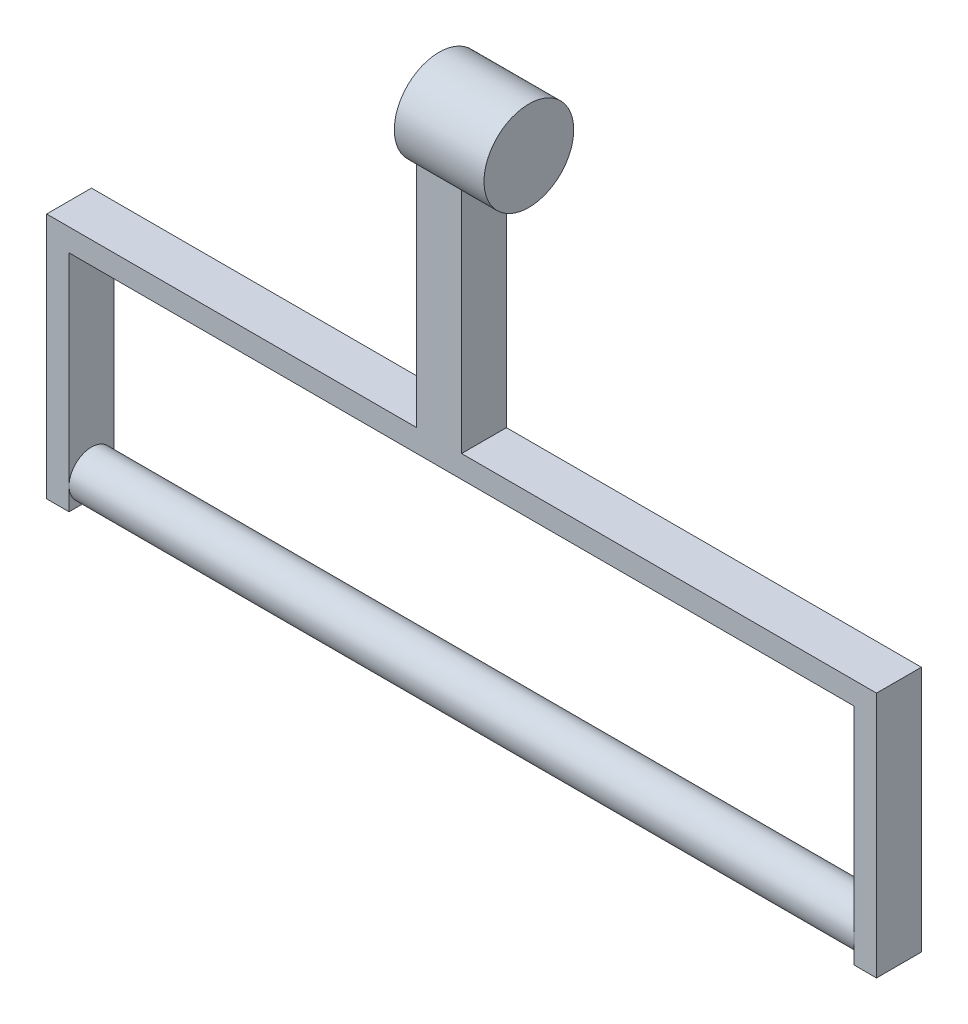
ISO-10303-21;
HEADER;
FILE_DESCRIPTION(('STEP AP214'),'2;1');
FILE_NAME('part.step','',(''),(''),'','','');
FILE_SCHEMA(('AUTOMOTIVE_DESIGN { 1 0 10303 214 1 1 1 1 }'));
ENDSEC;
DATA;
#1=APPLICATION_CONTEXT('core data for automotive mechanical design processes');
#2=APPLICATION_PROTOCOL_DEFINITION('international standard','automotive_design',2000,#1);
#3=PRODUCT_CONTEXT('',#1,'mechanical');
#4=PRODUCT('Part','Part','',(#3));
#5=PRODUCT_RELATED_PRODUCT_CATEGORY('part','',(#4));
#6=PRODUCT_DEFINITION_FORMATION('','',#4);
#7=PRODUCT_DEFINITION_CONTEXT('part definition',#1,'design');
#8=PRODUCT_DEFINITION('design','',#6,#7);
#9=PRODUCT_DEFINITION_SHAPE('','',#8);
#10=(LENGTH_UNIT() NAMED_UNIT(*) SI_UNIT(.MILLI.,.METRE.));
#11=(NAMED_UNIT(*) PLANE_ANGLE_UNIT() SI_UNIT($,.RADIAN.));
#12=(NAMED_UNIT(*) SI_UNIT($,.STERADIAN.) SOLID_ANGLE_UNIT());
#13=UNCERTAINTY_MEASURE_WITH_UNIT(LENGTH_MEASURE(1.E-05),#10,'distance_accuracy_value','');
#14=(GEOMETRIC_REPRESENTATION_CONTEXT(3) GLOBAL_UNCERTAINTY_ASSIGNED_CONTEXT((#13)) GLOBAL_UNIT_ASSIGNED_CONTEXT((#10,
#11,#12)) REPRESENTATION_CONTEXT('',''));
#15=CARTESIAN_POINT('',(0.,0.,0.));
#16=DIRECTION('',(0.,0.,1.));
#17=DIRECTION('',(1.,0.,0.));
#18=AXIS2_PLACEMENT_3D('',#15,#16,#17);
#19=CARTESIAN_POINT('',(0.,-59.9999999999999,0.));
#20=DIRECTION('',(-1.,0.,0.));
#21=DIRECTION('',(0.,0.,1.));
#22=AXIS2_PLACEMENT_3D('',#19,#20,#21);
#23=PLANE('',#22);
#24=CARTESIAN_POINT('',(0.,0.,5.));
#25=DIRECTION('',(1.,0.,0.));
#26=DIRECTION('',(0.,0.,-1.));
#27=AXIS2_PLACEMENT_3D('',#24,#25,#26);
#28=CIRCLE('',#27,10.);
#29=CARTESIAN_POINT('',(0.,-8.66025403784438,10.));
#30=VERTEX_POINT('',#29);
#31=CARTESIAN_POINT('',(0.,-8.66025403784438,0.));
#32=VERTEX_POINT('',#31);
#33=EDGE_CURVE('E182',#30,#32,#28,.T.);
#34=ORIENTED_EDGE('',*,*,#33,.F.);
#35=DIRECTION('',(0.,1.,0.));
#36=VECTOR('',#35,1.);
#37=CARTESIAN_POINT('',(0.,-59.9999999999999,10.));
#38=LINE('',#37,#36);
#39=CARTESIAN_POINT('',(0.,-59.9999999999999,10.));
#40=VERTEX_POINT('',#39);
#41=EDGE_CURVE('E189',#40,#30,#38,.T.);
#42=ORIENTED_EDGE('',*,*,#41,.F.);
#43=DIRECTION('',(0.,0.,1.));
#44=VECTOR('',#43,1.);
#45=CARTESIAN_POINT('',(0.,-59.9999999999999,0.));
#46=LINE('',#45,#44);
#47=CARTESIAN_POINT('',(0.,-59.9999999999999,0.));
#48=VERTEX_POINT('',#47);
#49=EDGE_CURVE('E206',#48,#40,#46,.T.);
#50=ORIENTED_EDGE('',*,*,#49,.F.);
#51=DIRECTION('',(0.,1.,0.));
#52=VECTOR('',#51,1.);
#53=CARTESIAN_POINT('',(0.,-59.9999999999999,0.));
#54=LINE('',#53,#52);
#55=EDGE_CURVE('E196',#48,#32,#54,.T.);
#56=ORIENTED_EDGE('',*,*,#55,.T.);
#57=EDGE_LOOP('',(#34,#42,#50,#56));
#58=FACE_BOUND('',#57,.T.);
#59=ADVANCED_FACE('F65',(#58),#23,.F.);
#60=CARTESIAN_POINT('',(-10.,0.,10.));
#61=DIRECTION('',(1.,0.,0.));
#62=DIRECTION('',(0.,1.,0.));
#63=AXIS2_PLACEMENT_3D('',#60,#61,#62);
#64=PLANE('',#63);
#65=DIRECTION('',(0.,-1.,0.));
#66=VECTOR('',#65,1.);
#67=CARTESIAN_POINT('',(-10.,0.,10.));
#68=LINE('',#67,#66);
#69=CARTESIAN_POINT('',(-10.,-8.66025403784438,10.));
#70=VERTEX_POINT('',#69);
#71=CARTESIAN_POINT('',(-9.99999999999999,-60.,10.));
#72=VERTEX_POINT('',#71);
#73=EDGE_CURVE('E73',#70,#72,#68,.T.);
#74=ORIENTED_EDGE('',*,*,#73,.F.);
#75=CARTESIAN_POINT('',(-10.,0.,5.00000000000001));
#76=DIRECTION('',(1.,0.,0.));
#77=DIRECTION('',(0.,0.,-1.));
#78=AXIS2_PLACEMENT_3D('',#75,#76,#77);
#79=CIRCLE('',#78,10.);
#80=CARTESIAN_POINT('',(-10.,-8.66025403784438,0.));
#81=VERTEX_POINT('',#80);
#82=EDGE_CURVE('E184',#81,#70,#79,.T.);
#83=ORIENTED_EDGE('',*,*,#82,.F.);
#84=DIRECTION('',(0.,-1.,0.));
#85=VECTOR('',#84,1.);
#86=CARTESIAN_POINT('',(-10.,0.,0.));
#87=LINE('',#86,#85);
#88=CARTESIAN_POINT('',(-9.99999999999999,-60.,0.));
#89=VERTEX_POINT('',#88);
#90=EDGE_CURVE('E284',#81,#89,#87,.T.);
#91=ORIENTED_EDGE('',*,*,#90,.T.);
#92=DIRECTION('',(0.,0.,-1.));
#93=VECTOR('',#92,1.);
#94=CARTESIAN_POINT('',(-9.99999999999999,-60.,10.));
#95=LINE('',#94,#93);
#96=EDGE_CURVE('E12',#72,#89,#95,.T.);
#97=ORIENTED_EDGE('',*,*,#96,.F.);
#98=EDGE_LOOP('',(#74,#83,#91,#97));
#99=FACE_BOUND('',#98,.T.);
#100=ADVANCED_FACE('F67',(#99),#64,.F.);
#101=CARTESIAN_POINT('',(0.,0.,10.));
#102=DIRECTION('',(0.,0.,1.));
#103=DIRECTION('',(1.,0.,0.));
#104=AXIS2_PLACEMENT_3D('',#101,#102,#103);
#105=PLANE('',#104);
#106=ORIENTED_EDGE('',*,*,#41,.T.);
#107=DIRECTION('',(1.,0.,0.));
#108=VECTOR('',#107,1.);
#109=CARTESIAN_POINT('',(-10.,-8.66025403784438,10.));
#110=LINE('',#109,#108);
#111=EDGE_CURVE('E176',#70,#30,#110,.T.);
#112=ORIENTED_EDGE('',*,*,#111,.F.);
#113=ORIENTED_EDGE('',*,*,#73,.T.);
#114=DIRECTION('',(-1.,0.,0.));
#115=VECTOR('',#114,1.);
#116=CARTESIAN_POINT('',(0.,-60.,10.));
#117=LINE('',#116,#115);
#118=CARTESIAN_POINT('',(-92.5,-60.,10.));
#119=VERTEX_POINT('',#118);
#120=EDGE_CURVE('E287',#72,#119,#117,.T.);
#121=ORIENTED_EDGE('',*,*,#120,.T.);
#122=DIRECTION('',(0.,1.,0.));
#123=VECTOR('',#122,1.);
#124=CARTESIAN_POINT('',(-92.5,-115.,10.));
#125=LINE('',#124,#123);
#126=CARTESIAN_POINT('',(-92.5,-115.,10.));
#127=VERTEX_POINT('',#126);
#128=EDGE_CURVE('E257',#127,#119,#125,.T.);
#129=ORIENTED_EDGE('',*,*,#128,.F.);
#130=DIRECTION('',(-1.,0.,0.));
#131=VECTOR('',#130,1.);
#132=CARTESIAN_POINT('',(0.,-115.,10.));
#133=LINE('',#132,#131);
#134=CARTESIAN_POINT('',(-87.5,-115.,10.));
#135=VERTEX_POINT('',#134);
#136=EDGE_CURVE('E255',#135,#127,#133,.T.);
#137=ORIENTED_EDGE('',*,*,#136,.F.);
#138=DIRECTION('',(0.,1.,0.));
#139=VECTOR('',#138,1.);
#140=CARTESIAN_POINT('',(-87.5,-115.,10.));
#141=LINE('',#140,#139);
#142=CARTESIAN_POINT('',(-87.5,-110.,10.));
#143=VERTEX_POINT('',#142);
#144=EDGE_CURVE('E263',#135,#143,#141,.T.);
#145=ORIENTED_EDGE('',*,*,#144,.T.);
#146=CARTESIAN_POINT('',(-87.5,-65.,10.));
#147=VERTEX_POINT('',#146);
#148=EDGE_CURVE('E262',#143,#147,#141,.T.);
#149=ORIENTED_EDGE('',*,*,#148,.T.);
#150=DIRECTION('',(-1.,0.,0.));
#151=VECTOR('',#150,1.);
#152=CARTESIAN_POINT('',(0.,-65.,10.));
#153=LINE('',#152,#151);
#154=CARTESIAN_POINT('',(87.5,-65.,10.));
#155=VERTEX_POINT('',#154);
#156=EDGE_CURVE('E281',#155,#147,#153,.T.);
#157=ORIENTED_EDGE('',*,*,#156,.F.);
#158=DIRECTION('',(0.,1.,0.));
#159=VECTOR('',#158,1.);
#160=CARTESIAN_POINT('',(87.5,-115.,10.));
#161=LINE('',#160,#159);
#162=CARTESIAN_POINT('',(87.5,-110.,10.));
#163=VERTEX_POINT('',#162);
#164=EDGE_CURVE('E239',#163,#155,#161,.T.);
#165=ORIENTED_EDGE('',*,*,#164,.F.);
#166=CARTESIAN_POINT('',(87.5,-115.,10.));
#167=VERTEX_POINT('',#166);
#168=EDGE_CURVE('E240',#167,#163,#161,.T.);
#169=ORIENTED_EDGE('',*,*,#168,.F.);
#170=DIRECTION('',(-1.,0.,0.));
#171=VECTOR('',#170,1.);
#172=CARTESIAN_POINT('',(0.,-115.,10.));
#173=LINE('',#172,#171);
#174=CARTESIAN_POINT('',(92.5,-115.,10.));
#175=VERTEX_POINT('',#174);
#176=EDGE_CURVE('E221',#175,#167,#173,.T.);
#177=ORIENTED_EDGE('',*,*,#176,.F.);
#178=DIRECTION('',(0.,1.,0.));
#179=VECTOR('',#178,1.);
#180=CARTESIAN_POINT('',(92.5,-115.,10.));
#181=LINE('',#180,#179);
#182=CARTESIAN_POINT('',(92.5,-60.,10.));
#183=VERTEX_POINT('',#182);
#184=EDGE_CURVE('E243',#175,#183,#181,.T.);
#185=ORIENTED_EDGE('',*,*,#184,.T.);
#186=EDGE_CURVE('E192',#183,#40,#117,.T.);
#187=ORIENTED_EDGE('',*,*,#186,.T.);
#188=EDGE_LOOP('',(#106,#112,#113,#121,#129,#137,#145,#149,#157,#165,#169,#177,#185,#187));
#189=FACE_BOUND('',#188,.T.);
#190=ADVANCED_FACE('F190',(#189),#105,.T.);
#191=CARTESIAN_POINT('',(0.,0.,0.));
#192=DIRECTION('',(0.,0.,1.));
#193=DIRECTION('',(1.,0.,0.));
#194=AXIS2_PLACEMENT_3D('',#191,#192,#193);
#195=PLANE('',#194);
#196=ORIENTED_EDGE('',*,*,#90,.F.);
#197=DIRECTION('',(1.,0.,0.));
#198=VECTOR('',#197,1.);
#199=CARTESIAN_POINT('',(-10.,-8.66025403784438,0.));
#200=LINE('',#199,#198);
#201=EDGE_CURVE('E186',#81,#32,#200,.T.);
#202=ORIENTED_EDGE('',*,*,#201,.T.);
#203=ORIENTED_EDGE('',*,*,#55,.F.);
#204=DIRECTION('',(-1.,0.,0.));
#205=VECTOR('',#204,1.);
#206=CARTESIAN_POINT('',(0.,-60.,0.));
#207=LINE('',#206,#205);
#208=CARTESIAN_POINT('',(92.5,-60.,0.));
#209=VERTEX_POINT('',#208);
#210=EDGE_CURVE('E285',#209,#48,#207,.T.);
#211=ORIENTED_EDGE('',*,*,#210,.F.);
#212=DIRECTION('',(0.,1.,0.));
#213=VECTOR('',#212,1.);
#214=CARTESIAN_POINT('',(92.5,-115.,0.));
#215=LINE('',#214,#213);
#216=CARTESIAN_POINT('',(92.5,-115.,0.));
#217=VERTEX_POINT('',#216);
#218=EDGE_CURVE('E230',#217,#209,#215,.T.);
#219=ORIENTED_EDGE('',*,*,#218,.F.);
#220=DIRECTION('',(1.,0.,0.));
#221=VECTOR('',#220,1.);
#222=CARTESIAN_POINT('',(0.,-115.,0.));
#223=LINE('',#222,#221);
#224=CARTESIAN_POINT('',(87.5,-115.,0.));
#225=VERTEX_POINT('',#224);
#226=EDGE_CURVE('E228',#225,#217,#223,.T.);
#227=ORIENTED_EDGE('',*,*,#226,.F.);
#228=DIRECTION('',(0.,1.,0.));
#229=VECTOR('',#228,1.);
#230=CARTESIAN_POINT('',(87.5,-115.,0.));
#231=LINE('',#230,#229);
#232=CARTESIAN_POINT('',(87.5000000000001,-110.,0.));
#233=VERTEX_POINT('',#232);
#234=EDGE_CURVE('E236',#225,#233,#231,.T.);
#235=ORIENTED_EDGE('',*,*,#234,.T.);
#236=CARTESIAN_POINT('',(87.5,-65.,0.));
#237=VERTEX_POINT('',#236);
#238=EDGE_CURVE('E235',#233,#237,#231,.T.);
#239=ORIENTED_EDGE('',*,*,#238,.T.);
#240=DIRECTION('',(-1.,0.,0.));
#241=VECTOR('',#240,1.);
#242=CARTESIAN_POINT('',(0.,-65.,0.));
#243=LINE('',#242,#241);
#244=CARTESIAN_POINT('',(-87.5,-65.,0.));
#245=VERTEX_POINT('',#244);
#246=EDGE_CURVE('E275',#237,#245,#243,.T.);
#247=ORIENTED_EDGE('',*,*,#246,.T.);
#248=DIRECTION('',(0.,1.,0.));
#249=VECTOR('',#248,1.);
#250=CARTESIAN_POINT('',(-87.5,-115.,0.));
#251=LINE('',#250,#249);
#252=CARTESIAN_POINT('',(-87.5,-110.,0.));
#253=VERTEX_POINT('',#252);
#254=EDGE_CURVE('E265',#253,#245,#251,.T.);
#255=ORIENTED_EDGE('',*,*,#254,.F.);
#256=CARTESIAN_POINT('',(-87.5,-115.,0.));
#257=VERTEX_POINT('',#256);
#258=EDGE_CURVE('E266',#257,#253,#251,.T.);
#259=ORIENTED_EDGE('',*,*,#258,.F.);
#260=DIRECTION('',(1.,0.,0.));
#261=VECTOR('',#260,1.);
#262=CARTESIAN_POINT('',(0.,-115.,-1.98239700611978E-13));
#263=LINE('',#262,#261);
#264=CARTESIAN_POINT('',(-92.5,-115.,0.));
#265=VERTEX_POINT('',#264);
#266=EDGE_CURVE('E249',#265,#257,#263,.T.);
#267=ORIENTED_EDGE('',*,*,#266,.F.);
#268=DIRECTION('',(0.,1.,0.));
#269=VECTOR('',#268,1.);
#270=CARTESIAN_POINT('',(-92.5,-115.,0.));
#271=LINE('',#270,#269);
#272=CARTESIAN_POINT('',(-92.5,-60.,0.));
#273=VERTEX_POINT('',#272);
#274=EDGE_CURVE('E268',#265,#273,#271,.T.);
#275=ORIENTED_EDGE('',*,*,#274,.T.);
#276=EDGE_CURVE('E271',#89,#273,#207,.T.);
#277=ORIENTED_EDGE('',*,*,#276,.F.);
#278=EDGE_LOOP('',(#196,#202,#203,#211,#219,#227,#235,#239,#247,#255,#259,#267,#275,#277));
#279=FACE_BOUND('',#278,.T.);
#280=ADVANCED_FACE('F297',(#279),#195,.F.);
#281=CARTESIAN_POINT('',(-87.5,-115.,0.));
#282=DIRECTION('',(-1.,0.,0.));
#283=DIRECTION('',(0.,0.,1.));
#284=AXIS2_PLACEMENT_3D('',#281,#282,#283);
#285=PLANE('',#284);
#286=CARTESIAN_POINT('',(-87.5,-110.,5.));
#287=DIRECTION('',(1.,0.,0.));
#288=DIRECTION('',(0.,0.,-1.));
#289=AXIS2_PLACEMENT_3D('',#286,#287,#288);
#290=CIRCLE('',#289,5.);
#291=CARTESIAN_POINT('',(-87.5,-115.,5.));
#292=VERTEX_POINT('',#291);
#293=EDGE_CURVE('E217',#143,#292,#290,.T.);
#294=ORIENTED_EDGE('',*,*,#293,.F.);
#295=ORIENTED_EDGE('',*,*,#144,.F.);
#296=DIRECTION('',(0.,0.,1.));
#297=VECTOR('',#296,1.);
#298=CARTESIAN_POINT('',(-87.5,-115.,0.));
#299=LINE('',#298,#297);
#300=EDGE_CURVE('E251',#292,#135,#299,.T.);
#301=ORIENTED_EDGE('',*,*,#300,.F.);
#302=EDGE_LOOP('',(#294,#295,#301));
#303=FACE_BOUND('',#302,.T.);
#304=ADVANCED_FACE('F311',(#303),#285,.F.);
#305=EDGE_CURVE('E88',#292,#253,#290,.T.);
#306=ORIENTED_EDGE('',*,*,#305,.F.);
#307=EDGE_CURVE('E252',#257,#292,#299,.T.);
#308=ORIENTED_EDGE('',*,*,#307,.F.);
#309=ORIENTED_EDGE('',*,*,#258,.T.);
#310=EDGE_LOOP('',(#306,#308,#309));
#311=FACE_BOUND('',#310,.T.);
#312=ADVANCED_FACE('F404',(#311),#285,.F.);
#313=CARTESIAN_POINT('',(87.5,-115.,0.));
#314=DIRECTION('',(-1.,0.,0.));
#315=DIRECTION('',(0.,0.,1.));
#316=AXIS2_PLACEMENT_3D('',#313,#314,#315);
#317=PLANE('',#316);
#318=ORIENTED_EDGE('',*,*,#168,.T.);
#319=CARTESIAN_POINT('',(87.5000000000001,-110.,5.));
#320=DIRECTION('',(1.,0.,0.));
#321=DIRECTION('',(0.,0.,-1.));
#322=AXIS2_PLACEMENT_3D('',#319,#320,#321);
#323=CIRCLE('',#322,5.);
#324=CARTESIAN_POINT('',(87.5000000000001,-115.,5.));
#325=VERTEX_POINT('',#324);
#326=EDGE_CURVE('E214',#163,#325,#323,.T.);
#327=ORIENTED_EDGE('',*,*,#326,.T.);
#328=DIRECTION('',(0.,0.,1.));
#329=VECTOR('',#328,1.);
#330=CARTESIAN_POINT('',(87.5,-115.,0.));
#331=LINE('',#330,#329);
#332=EDGE_CURVE('E224',#325,#167,#331,.T.);
#333=ORIENTED_EDGE('',*,*,#332,.T.);
#334=EDGE_LOOP('',(#318,#327,#333));
#335=FACE_BOUND('',#334,.T.);
#336=ADVANCED_FACE('F430',(#335),#317,.T.);
#337=EDGE_CURVE('E225',#225,#325,#331,.T.);
#338=ORIENTED_EDGE('',*,*,#337,.T.);
#339=EDGE_CURVE('E215',#325,#233,#323,.T.);
#340=ORIENTED_EDGE('',*,*,#339,.T.);
#341=ORIENTED_EDGE('',*,*,#234,.F.);
#342=EDGE_LOOP('',(#338,#340,#341));
#343=FACE_BOUND('',#342,.T.);
#344=ADVANCED_FACE('F413',(#343),#317,.T.);
#345=CARTESIAN_POINT('',(0.,-60.,0.));
#346=DIRECTION('',(0.,-1.,0.));
#347=DIRECTION('',(0.,0.,-1.));
#348=AXIS2_PLACEMENT_3D('',#345,#346,#347);
#349=PLANE('',#348);
#350=ORIENTED_EDGE('',*,*,#120,.F.);
#351=ORIENTED_EDGE('',*,*,#96,.T.);
#352=ORIENTED_EDGE('',*,*,#276,.T.);
#353=DIRECTION('',(0.,0.,-1.));
#354=VECTOR('',#353,1.);
#355=CARTESIAN_POINT('',(-92.5,-60.,0.));
#356=LINE('',#355,#354);
#357=EDGE_CURVE('E245',#119,#273,#356,.T.);
#358=ORIENTED_EDGE('',*,*,#357,.F.);
#359=EDGE_LOOP('',(#350,#351,#352,#358));
#360=FACE_BOUND('',#359,.T.);
#361=ADVANCED_FACE('F295',(#360),#349,.F.);
#362=CARTESIAN_POINT('',(0.,-65.,0.));
#363=DIRECTION('',(0.,-1.,0.));
#364=DIRECTION('',(0.,0.,-1.));
#365=AXIS2_PLACEMENT_3D('',#362,#363,#364);
#366=PLANE('',#365);
#367=DIRECTION('',(0.,0.,1.));
#368=VECTOR('',#367,1.);
#369=CARTESIAN_POINT('',(-87.5,-65.,0.));
#370=LINE('',#369,#368);
#371=EDGE_CURVE('E272',#245,#147,#370,.T.);
#372=ORIENTED_EDGE('',*,*,#371,.F.);
#373=ORIENTED_EDGE('',*,*,#246,.F.);
#374=DIRECTION('',(0.,0.,1.));
#375=VECTOR('',#374,1.);
#376=CARTESIAN_POINT('',(87.5,-65.,0.));
#377=LINE('',#376,#375);
#378=EDGE_CURVE('E278',#237,#155,#377,.T.);
#379=ORIENTED_EDGE('',*,*,#378,.T.);
#380=ORIENTED_EDGE('',*,*,#156,.T.);
#381=EDGE_LOOP('',(#372,#373,#379,#380));
#382=FACE_BOUND('',#381,.T.);
#383=ADVANCED_FACE('F497',(#382),#366,.T.);
#384=ORIENTED_EDGE('',*,*,#210,.T.);
#385=ORIENTED_EDGE('',*,*,#49,.T.);
#386=ORIENTED_EDGE('',*,*,#186,.F.);
#387=DIRECTION('',(0.,0.,1.));
#388=VECTOR('',#387,1.);
#389=CARTESIAN_POINT('',(92.5,-60.,0.));
#390=LINE('',#389,#388);
#391=EDGE_CURVE('E213',#209,#183,#390,.T.);
#392=ORIENTED_EDGE('',*,*,#391,.F.);
#393=EDGE_LOOP('',(#384,#385,#386,#392));
#394=FACE_BOUND('',#393,.T.);
#395=ADVANCED_FACE('F350',(#394),#349,.F.);
#396=EDGE_CURVE('E80',#253,#143,#290,.T.);
#397=ORIENTED_EDGE('',*,*,#396,.F.);
#398=ORIENTED_EDGE('',*,*,#254,.T.);
#399=ORIENTED_EDGE('',*,*,#371,.T.);
#400=ORIENTED_EDGE('',*,*,#148,.F.);
#401=EDGE_LOOP('',(#397,#398,#399,#400));
#402=FACE_BOUND('',#401,.T.);
#403=ADVANCED_FACE('F401',(#402),#285,.F.);
#404=CARTESIAN_POINT('',(-92.5,-115.,0.));
#405=DIRECTION('',(1.,0.,0.));
#406=DIRECTION('',(0.,0.,-1.));
#407=AXIS2_PLACEMENT_3D('',#404,#405,#406);
#408=PLANE('',#407);
#409=ORIENTED_EDGE('',*,*,#357,.T.);
#410=ORIENTED_EDGE('',*,*,#274,.F.);
#411=DIRECTION('',(0.,0.,-1.));
#412=VECTOR('',#411,1.);
#413=CARTESIAN_POINT('',(-92.5,-115.,0.));
#414=LINE('',#413,#412);
#415=EDGE_CURVE('E246',#127,#265,#414,.T.);
#416=ORIENTED_EDGE('',*,*,#415,.F.);
#417=ORIENTED_EDGE('',*,*,#128,.T.);
#418=EDGE_LOOP('',(#409,#410,#416,#417));
#419=FACE_BOUND('',#418,.T.);
#420=ADVANCED_FACE('F302',(#419),#408,.F.);
#421=CARTESIAN_POINT('',(0.,-115.,0.));
#422=DIRECTION('',(0.,-1.,0.));
#423=DIRECTION('',(0.,0.,-1.));
#424=AXIS2_PLACEMENT_3D('',#421,#422,#423);
#425=PLANE('',#424);
#426=ORIENTED_EDGE('',*,*,#415,.T.);
#427=ORIENTED_EDGE('',*,*,#266,.T.);
#428=ORIENTED_EDGE('',*,*,#307,.T.);
#429=ORIENTED_EDGE('',*,*,#300,.T.);
#430=ORIENTED_EDGE('',*,*,#136,.T.);
#431=EDGE_LOOP('',(#426,#427,#428,#429,#430));
#432=FACE_BOUND('',#431,.T.);
#433=ADVANCED_FACE('F307',(#432),#425,.T.);
#434=ORIENTED_EDGE('',*,*,#238,.F.);
#435=EDGE_CURVE('E210',#233,#163,#323,.T.);
#436=ORIENTED_EDGE('',*,*,#435,.T.);
#437=ORIENTED_EDGE('',*,*,#164,.T.);
#438=ORIENTED_EDGE('',*,*,#378,.F.);
#439=EDGE_LOOP('',(#434,#436,#437,#438));
#440=FACE_BOUND('',#439,.T.);
#441=ADVANCED_FACE('F420',(#440),#317,.T.);
#442=CARTESIAN_POINT('',(92.5,-115.,0.));
#443=DIRECTION('',(-1.,0.,0.));
#444=DIRECTION('',(0.,0.,1.));
#445=AXIS2_PLACEMENT_3D('',#442,#443,#444);
#446=PLANE('',#445);
#447=ORIENTED_EDGE('',*,*,#391,.T.);
#448=ORIENTED_EDGE('',*,*,#184,.F.);
#449=DIRECTION('',(0.,0.,1.));
#450=VECTOR('',#449,1.);
#451=CARTESIAN_POINT('',(92.5,-115.,0.));
#452=LINE('',#451,#450);
#453=EDGE_CURVE('E218',#217,#175,#452,.T.);
#454=ORIENTED_EDGE('',*,*,#453,.F.);
#455=ORIENTED_EDGE('',*,*,#218,.T.);
#456=EDGE_LOOP('',(#447,#448,#454,#455));
#457=FACE_BOUND('',#456,.T.);
#458=ADVANCED_FACE('F325',(#457),#446,.F.);
#459=CARTESIAN_POINT('',(0.,-115.,0.));
#460=DIRECTION('',(0.,-1.,0.));
#461=DIRECTION('',(0.,0.,-1.));
#462=AXIS2_PLACEMENT_3D('',#459,#460,#461);
#463=PLANE('',#462);
#464=ORIENTED_EDGE('',*,*,#453,.T.);
#465=ORIENTED_EDGE('',*,*,#176,.T.);
#466=ORIENTED_EDGE('',*,*,#332,.F.);
#467=ORIENTED_EDGE('',*,*,#337,.F.);
#468=ORIENTED_EDGE('',*,*,#226,.T.);
#469=EDGE_LOOP('',(#464,#465,#466,#467,#468));
#470=FACE_BOUND('',#469,.T.);
#471=ADVANCED_FACE('F315',(#470),#463,.T.);
#472=CARTESIAN_POINT('',(87.5000000000001,-110.,5.));
#473=DIRECTION('',(-1.,0.,0.));
#474=DIRECTION('',(0.,0.,1.));
#475=AXIS2_PLACEMENT_3D('',#472,#473,#474);
#476=CYLINDRICAL_SURFACE('',#475,5.);
#477=ORIENTED_EDGE('',*,*,#435,.F.);
#478=ORIENTED_EDGE('',*,*,#339,.F.);
#479=ORIENTED_EDGE('',*,*,#326,.F.);
#480=EDGE_LOOP('',(#477,#478,#479));
#481=FACE_BOUND('',#480,.T.);
#482=ORIENTED_EDGE('',*,*,#396,.T.);
#483=ORIENTED_EDGE('',*,*,#293,.T.);
#484=ORIENTED_EDGE('',*,*,#305,.T.);
#485=EDGE_LOOP('',(#482,#483,#484));
#486=FACE_BOUND('',#485,.T.);
#487=ADVANCED_FACE('F313',(#481,#486),#476,.T.);
#488=CARTESIAN_POINT('',(-10.,0.,5.00000000000001));
#489=DIRECTION('',(1.,0.,0.));
#490=DIRECTION('',(0.,0.,-1.));
#491=AXIS2_PLACEMENT_3D('',#488,#489,#490);
#492=CYLINDRICAL_SURFACE('',#491,10.);
#493=ORIENTED_EDGE('',*,*,#111,.T.);
#494=ORIENTED_EDGE('',*,*,#33,.T.);
#495=ORIENTED_EDGE('',*,*,#201,.F.);
#496=ORIENTED_EDGE('',*,*,#82,.T.);
#497=EDGE_LOOP('',(#493,#494,#495,#496));
#498=FACE_BOUND('',#497,.T.);
#499=CARTESIAN_POINT('',(10.,0.,5.));
#500=DIRECTION('',(1.,0.,0.));
#501=DIRECTION('',(0.,0.,-1.));
#502=AXIS2_PLACEMENT_3D('',#499,#500,#501);
#503=CIRCLE('',#502,10.);
#504=CARTESIAN_POINT('',(10.,0.,-5.));
#505=VERTEX_POINT('',#504);
#506=EDGE_CURVE('E200',#505,#505,#503,.T.);
#507=ORIENTED_EDGE('',*,*,#506,.F.);
#508=EDGE_LOOP('',(#507));
#509=FACE_BOUND('',#508,.T.);
#510=ADVANCED_FACE('F178',(#498,#509),#492,.T.);
#511=CARTESIAN_POINT('',(10.,0.,0.));
#512=DIRECTION('',(1.,0.,0.));
#513=DIRECTION('',(0.,0.,-1.));
#514=AXIS2_PLACEMENT_3D('',#511,#512,#513);
#515=PLANE('',#514);
#516=ORIENTED_EDGE('',*,*,#506,.T.);
#517=EDGE_LOOP('',(#516));
#518=FACE_BOUND('',#517,.T.);
#519=ADVANCED_FACE('F322',(#518),#515,.T.);
#520=CLOSED_SHELL('',(#59,#100,#190,#280,#304,#312,#336,#344,#361,#383,#395,#403,#420,#433,#441,
#458,#471,#487,#510,#519));
#521=MANIFOLD_SOLID_BREP('B2',#520);
#522=ADVANCED_BREP_SHAPE_REPRESENTATION('',(#18,#521),#14);
#523=SHAPE_DEFINITION_REPRESENTATION(#9,#522);
ENDSEC;
END-ISO-10303-21;
